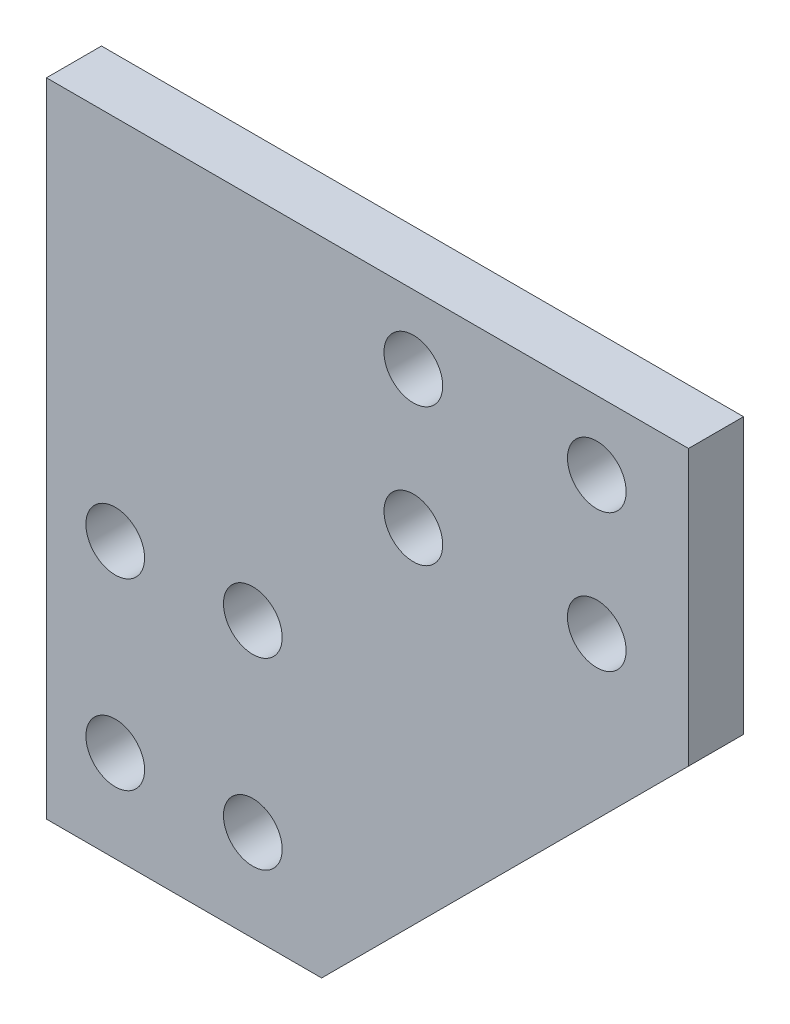
ISO-10303-21;
HEADER;
FILE_DESCRIPTION(('STEP AP214'),'2;1');
FILE_NAME('part.step','',(''),(''),'','','');
FILE_SCHEMA(('AUTOMOTIVE_DESIGN { 1 0 10303 214 1 1 1 1 }'));
ENDSEC;
DATA;
#1=APPLICATION_CONTEXT('core data for automotive mechanical design processes');
#2=APPLICATION_PROTOCOL_DEFINITION('international standard','automotive_design',2000,#1);
#3=PRODUCT_CONTEXT('',#1,'mechanical');
#4=PRODUCT('Part','Part','',(#3));
#5=PRODUCT_RELATED_PRODUCT_CATEGORY('part','',(#4));
#6=PRODUCT_DEFINITION_FORMATION('','',#4);
#7=PRODUCT_DEFINITION_CONTEXT('part definition',#1,'design');
#8=PRODUCT_DEFINITION('design','',#6,#7);
#9=PRODUCT_DEFINITION_SHAPE('','',#8);
#10=(LENGTH_UNIT() NAMED_UNIT(*) SI_UNIT(.MILLI.,.METRE.));
#11=(NAMED_UNIT(*) PLANE_ANGLE_UNIT() SI_UNIT($,.RADIAN.));
#12=(NAMED_UNIT(*) SI_UNIT($,.STERADIAN.) SOLID_ANGLE_UNIT());
#13=UNCERTAINTY_MEASURE_WITH_UNIT(LENGTH_MEASURE(1.E-05),#10,'distance_accuracy_value','');
#14=(GEOMETRIC_REPRESENTATION_CONTEXT(3) GLOBAL_UNCERTAINTY_ASSIGNED_CONTEXT((#13)) GLOBAL_UNIT_ASSIGNED_CONTEXT((#10,
#11,#12)) REPRESENTATION_CONTEXT('',''));
#15=CARTESIAN_POINT('',(0.,0.,0.));
#16=DIRECTION('',(0.,0.,1.));
#17=DIRECTION('',(1.,0.,0.));
#18=AXIS2_PLACEMENT_3D('',#15,#16,#17);
#19=CARTESIAN_POINT('',(0.,0.,3.));
#20=DIRECTION('',(0.,0.,-1.));
#21=DIRECTION('',(-1.,0.,0.));
#22=AXIS2_PLACEMENT_3D('',#19,#20,#21);
#23=PLANE('',#22);
#24=DIRECTION('',(0.,-1.,0.));
#25=VECTOR('',#24,1.);
#26=CARTESIAN_POINT('',(0.,-35.,3.));
#27=LINE('',#26,#25);
#28=CARTESIAN_POINT('',(0.,0.,3.));
#29=VERTEX_POINT('',#28);
#30=CARTESIAN_POINT('',(0.,-35.,3.));
#31=VERTEX_POINT('',#30);
#32=EDGE_CURVE('E125',#29,#31,#27,.T.);
#33=ORIENTED_EDGE('',*,*,#32,.T.);
#34=DIRECTION('',(1.,0.,0.));
#35=VECTOR('',#34,1.);
#36=CARTESIAN_POINT('',(15.,-35.,3.));
#37=LINE('',#36,#35);
#38=CARTESIAN_POINT('',(15.,-35.,3.));
#39=VERTEX_POINT('',#38);
#40=EDGE_CURVE('E92',#31,#39,#37,.T.);
#41=ORIENTED_EDGE('',*,*,#40,.T.);
#42=DIRECTION('',(0.707106781186548,0.707106781186548,0.));
#43=VECTOR('',#42,1.);
#44=CARTESIAN_POINT('',(35.,-15.,3.));
#45=LINE('',#44,#43);
#46=CARTESIAN_POINT('',(35.,-15.,3.));
#47=VERTEX_POINT('',#46);
#48=EDGE_CURVE('E96',#39,#47,#45,.T.);
#49=ORIENTED_EDGE('',*,*,#48,.T.);
#50=DIRECTION('',(0.,1.,0.));
#51=VECTOR('',#50,1.);
#52=CARTESIAN_POINT('',(35.,0.,3.));
#53=LINE('',#52,#51);
#54=CARTESIAN_POINT('',(35.,0.,3.));
#55=VERTEX_POINT('',#54);
#56=EDGE_CURVE('E100',#47,#55,#53,.T.);
#57=ORIENTED_EDGE('',*,*,#56,.T.);
#58=DIRECTION('',(-1.,0.,0.));
#59=VECTOR('',#58,1.);
#60=CARTESIAN_POINT('',(0.,0.,3.));
#61=LINE('',#60,#59);
#62=EDGE_CURVE('E58',#55,#29,#61,.T.);
#63=ORIENTED_EDGE('',*,*,#62,.T.);
#64=EDGE_LOOP('',(#33,#41,#49,#57,#63));
#65=FACE_BOUND('',#64,.T.);
#66=CARTESIAN_POINT('',(3.75,-30.,3.));
#67=DIRECTION('',(0.,0.,1.));
#68=DIRECTION('',(1.,0.,0.));
#69=AXIS2_PLACEMENT_3D('',#66,#67,#68);
#70=CIRCLE('',#69,1.6);
#71=CARTESIAN_POINT('',(5.35,-30.,3.));
#72=VERTEX_POINT('',#71);
#73=EDGE_CURVE('E120',#72,#72,#70,.T.);
#74=ORIENTED_EDGE('',*,*,#73,.F.);
#75=EDGE_LOOP('',(#74));
#76=FACE_BOUND('',#75,.T.);
#77=CARTESIAN_POINT('',(11.25,-30.,3.));
#78=DIRECTION('',(0.,0.,1.));
#79=DIRECTION('',(-1.,0.,0.));
#80=AXIS2_PLACEMENT_3D('',#77,#78,#79);
#81=CIRCLE('',#80,1.6);
#82=CARTESIAN_POINT('',(9.65,-30.,3.));
#83=VERTEX_POINT('',#82);
#84=EDGE_CURVE('E224',#83,#83,#81,.T.);
#85=ORIENTED_EDGE('',*,*,#84,.F.);
#86=EDGE_LOOP('',(#85));
#87=FACE_BOUND('',#86,.T.);
#88=CARTESIAN_POINT('',(11.25,-20.,3.));
#89=DIRECTION('',(0.,0.,1.));
#90=DIRECTION('',(1.,0.,0.));
#91=AXIS2_PLACEMENT_3D('',#88,#89,#90);
#92=CIRCLE('',#91,1.6);
#93=CARTESIAN_POINT('',(12.85,-20.,3.));
#94=VERTEX_POINT('',#93);
#95=EDGE_CURVE('E218',#94,#94,#92,.T.);
#96=ORIENTED_EDGE('',*,*,#95,.F.);
#97=EDGE_LOOP('',(#96));
#98=FACE_BOUND('',#97,.T.);
#99=CARTESIAN_POINT('',(3.75,-20.,3.));
#100=DIRECTION('',(0.,0.,1.));
#101=DIRECTION('',(-1.,0.,0.));
#102=AXIS2_PLACEMENT_3D('',#99,#100,#101);
#103=CIRCLE('',#102,1.6);
#104=CARTESIAN_POINT('',(2.15,-20.,3.));
#105=VERTEX_POINT('',#104);
#106=EDGE_CURVE('E212',#105,#105,#103,.T.);
#107=ORIENTED_EDGE('',*,*,#106,.F.);
#108=EDGE_LOOP('',(#107));
#109=FACE_BOUND('',#108,.T.);
#110=CARTESIAN_POINT('',(30.,-3.75,3.));
#111=DIRECTION('',(0.,0.,1.));
#112=DIRECTION('',(1.,0.,0.));
#113=AXIS2_PLACEMENT_3D('',#110,#111,#112);
#114=CIRCLE('',#113,1.6);
#115=CARTESIAN_POINT('',(31.6,-3.75,3.));
#116=VERTEX_POINT('',#115);
#117=EDGE_CURVE('E206',#116,#116,#114,.T.);
#118=ORIENTED_EDGE('',*,*,#117,.F.);
#119=EDGE_LOOP('',(#118));
#120=FACE_BOUND('',#119,.T.);
#121=CARTESIAN_POINT('',(30.,-11.25,3.));
#122=DIRECTION('',(0.,0.,1.));
#123=DIRECTION('',(-1.,0.,0.));
#124=AXIS2_PLACEMENT_3D('',#121,#122,#123);
#125=CIRCLE('',#124,1.6);
#126=CARTESIAN_POINT('',(28.4,-11.25,3.));
#127=VERTEX_POINT('',#126);
#128=EDGE_CURVE('E200',#127,#127,#125,.T.);
#129=ORIENTED_EDGE('',*,*,#128,.F.);
#130=EDGE_LOOP('',(#129));
#131=FACE_BOUND('',#130,.T.);
#132=CARTESIAN_POINT('',(20.,-11.25,3.));
#133=DIRECTION('',(0.,0.,1.));
#134=DIRECTION('',(1.,0.,0.));
#135=AXIS2_PLACEMENT_3D('',#132,#133,#134);
#136=CIRCLE('',#135,1.6);
#137=CARTESIAN_POINT('',(21.6,-11.25,3.));
#138=VERTEX_POINT('',#137);
#139=EDGE_CURVE('E194',#138,#138,#136,.T.);
#140=ORIENTED_EDGE('',*,*,#139,.F.);
#141=EDGE_LOOP('',(#140));
#142=FACE_BOUND('',#141,.T.);
#143=CARTESIAN_POINT('',(20.,-3.75,3.));
#144=DIRECTION('',(0.,0.,1.));
#145=DIRECTION('',(-1.,0.,0.));
#146=AXIS2_PLACEMENT_3D('',#143,#144,#145);
#147=CIRCLE('',#146,1.6);
#148=CARTESIAN_POINT('',(18.4,-3.75,3.));
#149=VERTEX_POINT('',#148);
#150=EDGE_CURVE('E185',#149,#149,#147,.T.);
#151=ORIENTED_EDGE('',*,*,#150,.F.);
#152=EDGE_LOOP('',(#151));
#153=FACE_BOUND('',#152,.T.);
#154=ADVANCED_FACE('F41',(#65,#76,#87,#98,#109,#120,#131,#142,#153),#23,.F.);
#155=CARTESIAN_POINT('',(0.,0.,0.));
#156=DIRECTION('',(0.,0.,-1.));
#157=DIRECTION('',(-1.,0.,0.));
#158=AXIS2_PLACEMENT_3D('',#155,#156,#157);
#159=PLANE('',#158);
#160=CARTESIAN_POINT('',(20.,-11.25,0.));
#161=DIRECTION('',(0.,0.,1.));
#162=DIRECTION('',(1.,0.,0.));
#163=AXIS2_PLACEMENT_3D('',#160,#161,#162);
#164=CIRCLE('',#163,1.6);
#165=CARTESIAN_POINT('',(21.6,-11.25,0.));
#166=VERTEX_POINT('',#165);
#167=EDGE_CURVE('E191',#166,#166,#164,.T.);
#168=ORIENTED_EDGE('',*,*,#167,.T.);
#169=EDGE_LOOP('',(#168));
#170=FACE_BOUND('',#169,.T.);
#171=CARTESIAN_POINT('',(30.,-3.75,0.));
#172=DIRECTION('',(0.,0.,1.));
#173=DIRECTION('',(1.,0.,0.));
#174=AXIS2_PLACEMENT_3D('',#171,#172,#173);
#175=CIRCLE('',#174,1.6);
#176=CARTESIAN_POINT('',(31.6,-3.75,0.));
#177=VERTEX_POINT('',#176);
#178=EDGE_CURVE('E203',#177,#177,#175,.T.);
#179=ORIENTED_EDGE('',*,*,#178,.T.);
#180=EDGE_LOOP('',(#179));
#181=FACE_BOUND('',#180,.T.);
#182=CARTESIAN_POINT('',(11.25,-20.,0.));
#183=DIRECTION('',(0.,0.,1.));
#184=DIRECTION('',(1.,0.,0.));
#185=AXIS2_PLACEMENT_3D('',#182,#183,#184);
#186=CIRCLE('',#185,1.6);
#187=CARTESIAN_POINT('',(12.85,-20.,0.));
#188=VERTEX_POINT('',#187);
#189=EDGE_CURVE('E215',#188,#188,#186,.T.);
#190=ORIENTED_EDGE('',*,*,#189,.T.);
#191=EDGE_LOOP('',(#190));
#192=FACE_BOUND('',#191,.T.);
#193=CARTESIAN_POINT('',(3.75,-30.,0.));
#194=DIRECTION('',(0.,0.,1.));
#195=DIRECTION('',(1.,0.,0.));
#196=AXIS2_PLACEMENT_3D('',#193,#194,#195);
#197=CIRCLE('',#196,1.6);
#198=CARTESIAN_POINT('',(5.35,-30.,0.));
#199=VERTEX_POINT('',#198);
#200=EDGE_CURVE('E227',#199,#199,#197,.T.);
#201=ORIENTED_EDGE('',*,*,#200,.T.);
#202=EDGE_LOOP('',(#201));
#203=FACE_BOUND('',#202,.T.);
#204=DIRECTION('',(0.,-1.,0.));
#205=VECTOR('',#204,1.);
#206=CARTESIAN_POINT('',(0.,-35.,0.));
#207=LINE('',#206,#205);
#208=CARTESIAN_POINT('',(0.,0.,0.));
#209=VERTEX_POINT('',#208);
#210=CARTESIAN_POINT('',(0.,-35.,0.));
#211=VERTEX_POINT('',#210);
#212=EDGE_CURVE('E116',#209,#211,#207,.T.);
#213=ORIENTED_EDGE('',*,*,#212,.F.);
#214=DIRECTION('',(-1.,0.,0.));
#215=VECTOR('',#214,1.);
#216=CARTESIAN_POINT('',(0.,0.,0.));
#217=LINE('',#216,#215);
#218=CARTESIAN_POINT('',(35.,0.,0.));
#219=VERTEX_POINT('',#218);
#220=EDGE_CURVE('E84',#219,#209,#217,.T.);
#221=ORIENTED_EDGE('',*,*,#220,.F.);
#222=DIRECTION('',(0.,1.,0.));
#223=VECTOR('',#222,1.);
#224=CARTESIAN_POINT('',(35.,0.,0.));
#225=LINE('',#224,#223);
#226=CARTESIAN_POINT('',(35.,-15.,0.));
#227=VERTEX_POINT('',#226);
#228=EDGE_CURVE('E78',#227,#219,#225,.T.);
#229=ORIENTED_EDGE('',*,*,#228,.F.);
#230=DIRECTION('',(0.707106781186548,0.707106781186548,0.));
#231=VECTOR('',#230,1.);
#232=CARTESIAN_POINT('',(35.,-15.,0.));
#233=LINE('',#232,#231);
#234=CARTESIAN_POINT('',(15.,-35.,0.));
#235=VERTEX_POINT('',#234);
#236=EDGE_CURVE('E107',#235,#227,#233,.T.);
#237=ORIENTED_EDGE('',*,*,#236,.F.);
#238=DIRECTION('',(1.,0.,0.));
#239=VECTOR('',#238,1.);
#240=CARTESIAN_POINT('',(15.,-35.,0.));
#241=LINE('',#240,#239);
#242=EDGE_CURVE('E119',#211,#235,#241,.T.);
#243=ORIENTED_EDGE('',*,*,#242,.F.);
#244=EDGE_LOOP('',(#213,#221,#229,#237,#243));
#245=FACE_BOUND('',#244,.T.);
#246=CARTESIAN_POINT('',(11.25,-30.,0.));
#247=DIRECTION('',(0.,0.,1.));
#248=DIRECTION('',(-1.,0.,0.));
#249=AXIS2_PLACEMENT_3D('',#246,#247,#248);
#250=CIRCLE('',#249,1.6);
#251=CARTESIAN_POINT('',(9.65,-30.,0.));
#252=VERTEX_POINT('',#251);
#253=EDGE_CURVE('E221',#252,#252,#250,.T.);
#254=ORIENTED_EDGE('',*,*,#253,.T.);
#255=EDGE_LOOP('',(#254));
#256=FACE_BOUND('',#255,.T.);
#257=CARTESIAN_POINT('',(3.75,-20.,0.));
#258=DIRECTION('',(0.,0.,1.));
#259=DIRECTION('',(-1.,0.,0.));
#260=AXIS2_PLACEMENT_3D('',#257,#258,#259);
#261=CIRCLE('',#260,1.6);
#262=CARTESIAN_POINT('',(2.15,-20.,0.));
#263=VERTEX_POINT('',#262);
#264=EDGE_CURVE('E209',#263,#263,#261,.T.);
#265=ORIENTED_EDGE('',*,*,#264,.T.);
#266=EDGE_LOOP('',(#265));
#267=FACE_BOUND('',#266,.T.);
#268=CARTESIAN_POINT('',(30.,-11.25,0.));
#269=DIRECTION('',(0.,0.,1.));
#270=DIRECTION('',(-1.,0.,0.));
#271=AXIS2_PLACEMENT_3D('',#268,#269,#270);
#272=CIRCLE('',#271,1.6);
#273=CARTESIAN_POINT('',(28.4,-11.25,0.));
#274=VERTEX_POINT('',#273);
#275=EDGE_CURVE('E197',#274,#274,#272,.T.);
#276=ORIENTED_EDGE('',*,*,#275,.T.);
#277=EDGE_LOOP('',(#276));
#278=FACE_BOUND('',#277,.T.);
#279=CARTESIAN_POINT('',(20.,-3.75,0.));
#280=DIRECTION('',(0.,0.,1.));
#281=DIRECTION('',(-1.,0.,0.));
#282=AXIS2_PLACEMENT_3D('',#279,#280,#281);
#283=CIRCLE('',#282,1.6);
#284=CARTESIAN_POINT('',(18.4,-3.75,0.));
#285=VERTEX_POINT('',#284);
#286=EDGE_CURVE('E188',#285,#285,#283,.T.);
#287=ORIENTED_EDGE('',*,*,#286,.T.);
#288=EDGE_LOOP('',(#287));
#289=FACE_BOUND('',#288,.T.);
#290=ADVANCED_FACE('F129',(#170,#181,#192,#203,#245,#256,#267,#278,#289),#159,.T.);
#291=CARTESIAN_POINT('',(0.,-35.,3.));
#292=DIRECTION('',(1.,0.,0.));
#293=DIRECTION('',(0.,0.,-1.));
#294=AXIS2_PLACEMENT_3D('',#291,#292,#293);
#295=PLANE('',#294);
#296=ORIENTED_EDGE('',*,*,#212,.T.);
#297=DIRECTION('',(0.,0.,-1.));
#298=VECTOR('',#297,1.);
#299=CARTESIAN_POINT('',(0.,-35.,3.));
#300=LINE('',#299,#298);
#301=EDGE_CURVE('E11',#31,#211,#300,.T.);
#302=ORIENTED_EDGE('',*,*,#301,.F.);
#303=ORIENTED_EDGE('',*,*,#32,.F.);
#304=DIRECTION('',(0.,0.,-1.));
#305=VECTOR('',#304,1.);
#306=CARTESIAN_POINT('',(0.,0.,3.));
#307=LINE('',#306,#305);
#308=EDGE_CURVE('E112',#29,#209,#307,.T.);
#309=ORIENTED_EDGE('',*,*,#308,.T.);
#310=EDGE_LOOP('',(#296,#302,#303,#309));
#311=FACE_BOUND('',#310,.T.);
#312=ADVANCED_FACE('F43',(#311),#295,.F.);
#313=CARTESIAN_POINT('',(15.,-35.,3.));
#314=DIRECTION('',(0.,1.,0.));
#315=DIRECTION('',(0.,0.,1.));
#316=AXIS2_PLACEMENT_3D('',#313,#314,#315);
#317=PLANE('',#316);
#318=ORIENTED_EDGE('',*,*,#242,.T.);
#319=DIRECTION('',(0.,0.,-1.));
#320=VECTOR('',#319,1.);
#321=CARTESIAN_POINT('',(15.,-35.,3.));
#322=LINE('',#321,#320);
#323=EDGE_CURVE('E50',#39,#235,#322,.T.);
#324=ORIENTED_EDGE('',*,*,#323,.F.);
#325=ORIENTED_EDGE('',*,*,#40,.F.);
#326=ORIENTED_EDGE('',*,*,#301,.T.);
#327=EDGE_LOOP('',(#318,#324,#325,#326));
#328=FACE_BOUND('',#327,.T.);
#329=ADVANCED_FACE('F317',(#328),#317,.F.);
#330=CARTESIAN_POINT('',(35.,-15.,3.));
#331=DIRECTION('',(-0.707106781186547,0.707106781186547,0.));
#332=DIRECTION('',(-0.707106781186548,-0.707106781186548,0.));
#333=AXIS2_PLACEMENT_3D('',#330,#331,#332);
#334=PLANE('',#333);
#335=ORIENTED_EDGE('',*,*,#236,.T.);
#336=DIRECTION('',(0.,0.,-1.));
#337=VECTOR('',#336,1.);
#338=CARTESIAN_POINT('',(35.,-15.,3.));
#339=LINE('',#338,#337);
#340=EDGE_CURVE('E104',#47,#227,#339,.T.);
#341=ORIENTED_EDGE('',*,*,#340,.F.);
#342=ORIENTED_EDGE('',*,*,#48,.F.);
#343=ORIENTED_EDGE('',*,*,#323,.T.);
#344=EDGE_LOOP('',(#335,#341,#342,#343));
#345=FACE_BOUND('',#344,.T.);
#346=ADVANCED_FACE('F105',(#345),#334,.F.);
#347=CARTESIAN_POINT('',(35.,0.,3.));
#348=DIRECTION('',(-1.,0.,0.));
#349=DIRECTION('',(0.,0.,1.));
#350=AXIS2_PLACEMENT_3D('',#347,#348,#349);
#351=PLANE('',#350);
#352=ORIENTED_EDGE('',*,*,#228,.T.);
#353=DIRECTION('',(0.,0.,-1.));
#354=VECTOR('',#353,1.);
#355=CARTESIAN_POINT('',(35.,0.,3.));
#356=LINE('',#355,#354);
#357=EDGE_CURVE('E108',#55,#219,#356,.T.);
#358=ORIENTED_EDGE('',*,*,#357,.F.);
#359=ORIENTED_EDGE('',*,*,#56,.F.);
#360=ORIENTED_EDGE('',*,*,#340,.T.);
#361=EDGE_LOOP('',(#352,#358,#359,#360));
#362=FACE_BOUND('',#361,.T.);
#363=ADVANCED_FACE('F110',(#362),#351,.F.);
#364=CARTESIAN_POINT('',(0.,0.,3.));
#365=DIRECTION('',(0.,-1.,0.));
#366=DIRECTION('',(0.,0.,-1.));
#367=AXIS2_PLACEMENT_3D('',#364,#365,#366);
#368=PLANE('',#367);
#369=ORIENTED_EDGE('',*,*,#220,.T.);
#370=ORIENTED_EDGE('',*,*,#308,.F.);
#371=ORIENTED_EDGE('',*,*,#62,.F.);
#372=ORIENTED_EDGE('',*,*,#357,.T.);
#373=EDGE_LOOP('',(#369,#370,#371,#372));
#374=FACE_BOUND('',#373,.T.);
#375=ADVANCED_FACE('F134',(#374),#368,.F.);
#376=CARTESIAN_POINT('',(3.75,-30.,3.));
#377=DIRECTION('',(0.,0.,-1.));
#378=DIRECTION('',(-1.,0.,0.));
#379=AXIS2_PLACEMENT_3D('',#376,#377,#378);
#380=CYLINDRICAL_SURFACE('',#379,1.6);
#381=ORIENTED_EDGE('',*,*,#73,.T.);
#382=EDGE_LOOP('',(#381));
#383=FACE_BOUND('',#382,.T.);
#384=ORIENTED_EDGE('',*,*,#200,.F.);
#385=EDGE_LOOP('',(#384));
#386=FACE_BOUND('',#385,.T.);
#387=ADVANCED_FACE('F136',(#383,#386),#380,.F.);
#388=CARTESIAN_POINT('',(11.25,-30.,3.));
#389=DIRECTION('',(0.,0.,-1.));
#390=DIRECTION('',(-1.,0.,0.));
#391=AXIS2_PLACEMENT_3D('',#388,#389,#390);
#392=CYLINDRICAL_SURFACE('',#391,1.6);
#393=ORIENTED_EDGE('',*,*,#84,.T.);
#394=EDGE_LOOP('',(#393));
#395=FACE_BOUND('',#394,.T.);
#396=ORIENTED_EDGE('',*,*,#253,.F.);
#397=EDGE_LOOP('',(#396));
#398=FACE_BOUND('',#397,.T.);
#399=ADVANCED_FACE('F142',(#395,#398),#392,.F.);
#400=CARTESIAN_POINT('',(11.25,-20.,3.));
#401=DIRECTION('',(0.,0.,-1.));
#402=DIRECTION('',(-1.,0.,0.));
#403=AXIS2_PLACEMENT_3D('',#400,#401,#402);
#404=CYLINDRICAL_SURFACE('',#403,1.6);
#405=ORIENTED_EDGE('',*,*,#95,.T.);
#406=EDGE_LOOP('',(#405));
#407=FACE_BOUND('',#406,.T.);
#408=ORIENTED_EDGE('',*,*,#189,.F.);
#409=EDGE_LOOP('',(#408));
#410=FACE_BOUND('',#409,.T.);
#411=ADVANCED_FACE('F156',(#407,#410),#404,.F.);
#412=CARTESIAN_POINT('',(3.75,-20.,3.));
#413=DIRECTION('',(0.,0.,-1.));
#414=DIRECTION('',(-1.,0.,0.));
#415=AXIS2_PLACEMENT_3D('',#412,#413,#414);
#416=CYLINDRICAL_SURFACE('',#415,1.6);
#417=ORIENTED_EDGE('',*,*,#106,.T.);
#418=EDGE_LOOP('',(#417));
#419=FACE_BOUND('',#418,.T.);
#420=ORIENTED_EDGE('',*,*,#264,.F.);
#421=EDGE_LOOP('',(#420));
#422=FACE_BOUND('',#421,.T.);
#423=ADVANCED_FACE('F160',(#419,#422),#416,.F.);
#424=CARTESIAN_POINT('',(30.,-3.75,3.));
#425=DIRECTION('',(0.,0.,-1.));
#426=DIRECTION('',(-1.,0.,0.));
#427=AXIS2_PLACEMENT_3D('',#424,#425,#426);
#428=CYLINDRICAL_SURFACE('',#427,1.6);
#429=ORIENTED_EDGE('',*,*,#117,.T.);
#430=EDGE_LOOP('',(#429));
#431=FACE_BOUND('',#430,.T.);
#432=ORIENTED_EDGE('',*,*,#178,.F.);
#433=EDGE_LOOP('',(#432));
#434=FACE_BOUND('',#433,.T.);
#435=ADVANCED_FACE('F164',(#431,#434),#428,.F.);
#436=CARTESIAN_POINT('',(30.,-11.25,3.));
#437=DIRECTION('',(0.,0.,-1.));
#438=DIRECTION('',(-1.,0.,0.));
#439=AXIS2_PLACEMENT_3D('',#436,#437,#438);
#440=CYLINDRICAL_SURFACE('',#439,1.6);
#441=ORIENTED_EDGE('',*,*,#128,.T.);
#442=EDGE_LOOP('',(#441));
#443=FACE_BOUND('',#442,.T.);
#444=ORIENTED_EDGE('',*,*,#275,.F.);
#445=EDGE_LOOP('',(#444));
#446=FACE_BOUND('',#445,.T.);
#447=ADVANCED_FACE('F168',(#443,#446),#440,.F.);
#448=CARTESIAN_POINT('',(20.,-11.25,3.));
#449=DIRECTION('',(0.,0.,-1.));
#450=DIRECTION('',(-1.,0.,0.));
#451=AXIS2_PLACEMENT_3D('',#448,#449,#450);
#452=CYLINDRICAL_SURFACE('',#451,1.6);
#453=ORIENTED_EDGE('',*,*,#139,.T.);
#454=EDGE_LOOP('',(#453));
#455=FACE_BOUND('',#454,.T.);
#456=ORIENTED_EDGE('',*,*,#167,.F.);
#457=EDGE_LOOP('',(#456));
#458=FACE_BOUND('',#457,.T.);
#459=ADVANCED_FACE('F172',(#455,#458),#452,.F.);
#460=CARTESIAN_POINT('',(20.,-3.75,3.));
#461=DIRECTION('',(0.,0.,-1.));
#462=DIRECTION('',(-1.,0.,0.));
#463=AXIS2_PLACEMENT_3D('',#460,#461,#462);
#464=CYLINDRICAL_SURFACE('',#463,1.6);
#465=ORIENTED_EDGE('',*,*,#150,.T.);
#466=EDGE_LOOP('',(#465));
#467=FACE_BOUND('',#466,.T.);
#468=ORIENTED_EDGE('',*,*,#286,.F.);
#469=EDGE_LOOP('',(#468));
#470=FACE_BOUND('',#469,.T.);
#471=ADVANCED_FACE('F176',(#467,#470),#464,.F.);
#472=CLOSED_SHELL('',(#154,#290,#312,#329,#346,#363,#375,#387,#399,#411,#423,#435,#447,#459,#471));
#473=MANIFOLD_SOLID_BREP('B2',#472);
#474=ADVANCED_BREP_SHAPE_REPRESENTATION('',(#18,#473),#14);
#475=SHAPE_DEFINITION_REPRESENTATION(#9,#474);
ENDSEC;
END-ISO-10303-21;
